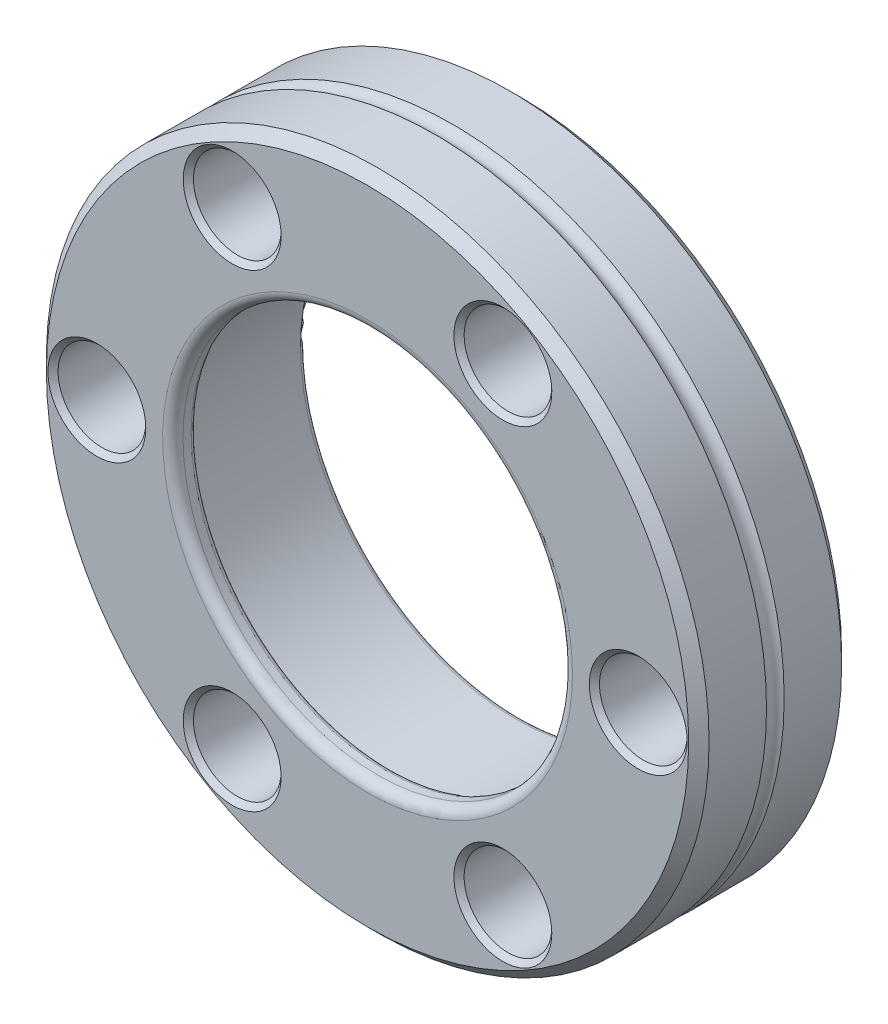
ISO-10303-21;
HEADER;
FILE_DESCRIPTION(('STEP AP214'),'2;1');
FILE_NAME('part.step','',(''),(''),'','','');
FILE_SCHEMA(('AUTOMOTIVE_DESIGN { 1 0 10303 214 1 1 1 1 }'));
ENDSEC;
DATA;
#1=APPLICATION_CONTEXT('core data for automotive mechanical design processes');
#2=APPLICATION_PROTOCOL_DEFINITION('international standard','automotive_design',2000,#1);
#3=PRODUCT_CONTEXT('',#1,'mechanical');
#4=PRODUCT('Part','Part','',(#3));
#5=PRODUCT_RELATED_PRODUCT_CATEGORY('part','',(#4));
#6=PRODUCT_DEFINITION_FORMATION('','',#4);
#7=PRODUCT_DEFINITION_CONTEXT('part definition',#1,'design');
#8=PRODUCT_DEFINITION('design','',#6,#7);
#9=PRODUCT_DEFINITION_SHAPE('','',#8);
#10=(LENGTH_UNIT() NAMED_UNIT(*) SI_UNIT(.MILLI.,.METRE.));
#11=(NAMED_UNIT(*) PLANE_ANGLE_UNIT() SI_UNIT($,.RADIAN.));
#12=(NAMED_UNIT(*) SI_UNIT($,.STERADIAN.) SOLID_ANGLE_UNIT());
#13=UNCERTAINTY_MEASURE_WITH_UNIT(LENGTH_MEASURE(1.E-05),#10,'distance_accuracy_value','');
#14=(GEOMETRIC_REPRESENTATION_CONTEXT(3) GLOBAL_UNCERTAINTY_ASSIGNED_CONTEXT((#13)) GLOBAL_UNIT_ASSIGNED_CONTEXT((#10,
#11,#12)) REPRESENTATION_CONTEXT('',''));
#15=CARTESIAN_POINT('',(0.,0.,0.));
#16=DIRECTION('',(0.,0.,1.));
#17=DIRECTION('',(1.,0.,0.));
#18=AXIS2_PLACEMENT_3D('',#15,#16,#17);
#19=CARTESIAN_POINT('',(0.,0.,-3.81));
#20=DIRECTION('',(0.,0.,1.));
#21=DIRECTION('',(-1.,0.,0.));
#22=AXIS2_PLACEMENT_3D('',#19,#20,#21);
#23=CYLINDRICAL_SURFACE('',#22,10.7061);
#24=CARTESIAN_POINT('',(0.,0.,-3.556));
#25=DIRECTION('',(0.,0.,1.));
#26=DIRECTION('',(-1.,0.,0.));
#27=AXIS2_PLACEMENT_3D('',#24,#25,#26);
#28=CIRCLE('',#27,10.7061);
#29=CARTESIAN_POINT('',(-10.7061,0.,-3.556));
#30=VERTEX_POINT('',#29);
#31=EDGE_CURVE('E230',#30,#30,#28,.T.);
#32=ORIENTED_EDGE('',*,*,#31,.F.);
#33=EDGE_LOOP('',(#32));
#34=FACE_BOUND('',#33,.T.);
#35=CARTESIAN_POINT('',(0.,0.,2.2606));
#36=DIRECTION('',(0.,0.,-1.));
#37=DIRECTION('',(-1.,0.,0.));
#38=AXIS2_PLACEMENT_3D('',#35,#36,#37);
#39=CIRCLE('',#38,10.7061);
#40=CARTESIAN_POINT('',(-10.7061,0.,2.2606));
#41=VERTEX_POINT('',#40);
#42=EDGE_CURVE('E221',#41,#41,#39,.T.);
#43=ORIENTED_EDGE('',*,*,#42,.F.);
#44=EDGE_LOOP('',(#43));
#45=FACE_BOUND('',#44,.T.);
#46=ADVANCED_FACE('F16',(#34,#45),#23,.F.);
#47=CARTESIAN_POINT('',(-6.74369999999402,11.6804310309919,3.81000000004406));
#48=DIRECTION('',(0.,0.,1.));
#49=DIRECTION('',(0.,-1.,0.));
#50=AXIS2_PLACEMENT_3D('',#47,#48,#49);
#51=CONICAL_SURFACE('',#50,2.43839999999539,0.785398163397448);
#52=CARTESIAN_POINT('',(-6.74369999999402,11.6804310309919,3.556));
#53=DIRECTION('',(0.,0.,-1.));
#54=DIRECTION('',(1.,0.,0.));
#55=AXIS2_PLACEMENT_3D('',#52,#53,#54);
#56=CIRCLE('',#55,2.1844);
#57=CARTESIAN_POINT('',(-4.55929999999402,11.6804310309919,3.556));
#58=VERTEX_POINT('',#57);
#59=EDGE_CURVE('E278',#58,#58,#56,.T.);
#60=ORIENTED_EDGE('',*,*,#59,.T.);
#61=EDGE_LOOP('',(#60));
#62=FACE_BOUND('',#61,.T.);
#63=CARTESIAN_POINT('',(-6.74369999999402,11.6804310309919,3.81000000004406));
#64=DIRECTION('',(0.,0.,-1.));
#65=DIRECTION('',(0.,-1.,0.));
#66=AXIS2_PLACEMENT_3D('',#63,#64,#65);
#67=CIRCLE('',#66,2.43839999999539);
#68=CARTESIAN_POINT('',(-6.74369999999402,9.24203103099651,3.81000000004406));
#69=VERTEX_POINT('',#68);
#70=EDGE_CURVE('E259',#69,#69,#67,.T.);
#71=ORIENTED_EDGE('',*,*,#70,.F.);
#72=EDGE_LOOP('',(#71));
#73=FACE_BOUND('',#72,.T.);
#74=ADVANCED_FACE('F329',(#62,#73),#51,.F.);
#75=CARTESIAN_POINT('',(0.,0.,3.81));
#76=DIRECTION('',(0.,0.,-1.));
#77=DIRECTION('',(1.,0.,0.));
#78=AXIS2_PLACEMENT_3D('',#75,#76,#77);
#79=CYLINDRICAL_SURFACE('',#78,9.7028);
#80=CARTESIAN_POINT('',(0.,0.,3.302));
#81=DIRECTION('',(0.,0.,-1.));
#82=DIRECTION('',(1.,0.,0.));
#83=AXIS2_PLACEMENT_3D('',#80,#81,#82);
#84=CIRCLE('',#83,9.7028);
#85=CARTESIAN_POINT('',(9.7028,0.,3.302));
#86=VERTEX_POINT('',#85);
#87=EDGE_CURVE('E214',#86,#86,#84,.T.);
#88=ORIENTED_EDGE('',*,*,#87,.F.);
#89=EDGE_LOOP('',(#88));
#90=FACE_BOUND('',#89,.T.);
#91=CARTESIAN_POINT('',(0.,0.,2.8956));
#92=DIRECTION('',(0.,0.,1.));
#93=DIRECTION('',(1.,0.,0.));
#94=AXIS2_PLACEMENT_3D('',#91,#92,#93);
#95=CIRCLE('',#94,9.7028);
#96=CARTESIAN_POINT('',(9.7028,0.,2.8956));
#97=VERTEX_POINT('',#96);
#98=EDGE_CURVE('E243',#97,#97,#95,.T.);
#99=ORIENTED_EDGE('',*,*,#98,.F.);
#100=EDGE_LOOP('',(#99));
#101=FACE_BOUND('',#100,.T.);
#102=ADVANCED_FACE('F335',(#90,#101),#79,.F.);
#103=CARTESIAN_POINT('',(13.487399999988,0.,3.80999999998722));
#104=DIRECTION('',(0.,0.,1.));
#105=DIRECTION('',(1.,0.,0.));
#106=AXIS2_PLACEMENT_3D('',#103,#104,#105);
#107=CONICAL_SURFACE('',#106,2.43840000005973,0.785398163509344);
#108=CARTESIAN_POINT('',(13.487399999988,0.,3.556));
#109=DIRECTION('',(0.,0.,-1.));
#110=DIRECTION('',(1.,0.,0.));
#111=AXIS2_PLACEMENT_3D('',#108,#109,#110);
#112=CIRCLE('',#111,2.1844);
#113=CARTESIAN_POINT('',(15.671799999988,0.,3.556));
#114=VERTEX_POINT('',#113);
#115=EDGE_CURVE('E275',#114,#114,#112,.T.);
#116=ORIENTED_EDGE('',*,*,#115,.T.);
#117=EDGE_LOOP('',(#116));
#118=FACE_BOUND('',#117,.T.);
#119=CARTESIAN_POINT('',(13.487399999988,0.,3.80999999998722));
#120=DIRECTION('',(0.,0.,-1.));
#121=DIRECTION('',(1.,0.,0.));
#122=AXIS2_PLACEMENT_3D('',#119,#120,#121);
#123=CIRCLE('',#122,2.43840000005973);
#124=CARTESIAN_POINT('',(15.9258000000477,0.,3.80999999998722));
#125=VERTEX_POINT('',#124);
#126=EDGE_CURVE('E291',#125,#125,#123,.T.);
#127=ORIENTED_EDGE('',*,*,#126,.F.);
#128=EDGE_LOOP('',(#127));
#129=FACE_BOUND('',#128,.T.);
#130=ADVANCED_FACE('F325',(#118,#129),#107,.F.);
#131=CARTESIAN_POINT('',(6.74369999999402,-11.6804310309919,3.81));
#132=DIRECTION('',(0.,0.,-1.));
#133=DIRECTION('',(1.,0.,0.));
#134=AXIS2_PLACEMENT_3D('',#131,#132,#133);
#135=CYLINDRICAL_SURFACE('',#134,2.1844);
#136=CARTESIAN_POINT('',(6.74369999999402,-11.6804310309919,3.556));
#137=DIRECTION('',(0.,0.,-1.));
#138=DIRECTION('',(1.,0.,0.));
#139=AXIS2_PLACEMENT_3D('',#136,#137,#138);
#140=CIRCLE('',#139,2.1844);
#141=CARTESIAN_POINT('',(8.92809999999402,-11.6804310309919,3.556));
#142=VERTEX_POINT('',#141);
#143=EDGE_CURVE('E294',#142,#142,#140,.T.);
#144=ORIENTED_EDGE('',*,*,#143,.F.);
#145=EDGE_LOOP('',(#144));
#146=FACE_BOUND('',#145,.T.);
#147=CARTESIAN_POINT('',(6.74369999999402,-11.6804310309919,-3.55600000000323));
#148=DIRECTION('',(0.,0.,-1.));
#149=DIRECTION('',(-1.,0.,0.));
#150=AXIS2_PLACEMENT_3D('',#147,#148,#149);
#151=CIRCLE('',#150,2.1844000000114);
#152=CARTESIAN_POINT('',(4.55929999998262,-11.6804310309919,-3.55600000000323));
#153=VERTEX_POINT('',#152);
#154=EDGE_CURVE('E11',#153,#153,#151,.T.);
#155=ORIENTED_EDGE('',*,*,#154,.T.);
#156=EDGE_LOOP('',(#155));
#157=FACE_BOUND('',#156,.T.);
#158=ADVANCED_FACE('F314',(#146,#157),#135,.F.);
#159=CARTESIAN_POINT('',(-6.74369999999402,-11.6804310309919,3.81));
#160=DIRECTION('',(0.,0.,-1.));
#161=DIRECTION('',(1.,0.,0.));
#162=AXIS2_PLACEMENT_3D('',#159,#160,#161);
#163=CYLINDRICAL_SURFACE('',#162,2.1844);
#164=CARTESIAN_POINT('',(-6.74369999999402,-11.6804310309919,3.556));
#165=DIRECTION('',(0.,0.,-1.));
#166=DIRECTION('',(1.,0.,0.));
#167=AXIS2_PLACEMENT_3D('',#164,#165,#166);
#168=CIRCLE('',#167,2.1844);
#169=CARTESIAN_POINT('',(-4.55929999999402,-11.6804310309919,3.556));
#170=VERTEX_POINT('',#169);
#171=EDGE_CURVE('E19',#170,#170,#168,.T.);
#172=ORIENTED_EDGE('',*,*,#171,.F.);
#173=EDGE_LOOP('',(#172));
#174=FACE_BOUND('',#173,.T.);
#175=CARTESIAN_POINT('',(-6.74369999999402,-11.6804310309919,-3.55600000006006));
#176=DIRECTION('',(0.,0.,-1.));
#177=DIRECTION('',(-1.,0.,0.));
#178=AXIS2_PLACEMENT_3D('',#175,#176,#177);
#179=CIRCLE('',#178,2.18439999999743);
#180=CARTESIAN_POINT('',(-8.92809999999145,-11.6804310309919,-3.55600000006006));
#181=VERTEX_POINT('',#180);
#182=EDGE_CURVE('E191',#181,#181,#179,.T.);
#183=ORIENTED_EDGE('',*,*,#182,.T.);
#184=EDGE_LOOP('',(#183));
#185=FACE_BOUND('',#184,.T.);
#186=ADVANCED_FACE('F192',(#174,#185),#163,.F.);
#187=CARTESIAN_POINT('',(0.,0.,3.302));
#188=DIRECTION('',(0.,0.,-1.));
#189=DIRECTION('',(0.,1.,0.));
#190=AXIS2_PLACEMENT_3D('',#187,#188,#189);
#191=CONICAL_SURFACE('',#190,16.51,0.78539816339745);
#192=CARTESIAN_POINT('',(0.,0.,3.81));
#193=DIRECTION('',(0.,0.,-1.));
#194=DIRECTION('',(0.,1.,0.));
#195=AXIS2_PLACEMENT_3D('',#192,#193,#194);
#196=CIRCLE('',#195,16.002);
#197=CARTESIAN_POINT('',(0.,16.002,3.81));
#198=VERTEX_POINT('',#197);
#199=EDGE_CURVE('E281',#198,#198,#196,.T.);
#200=ORIENTED_EDGE('',*,*,#199,.T.);
#201=EDGE_LOOP('',(#200));
#202=FACE_BOUND('',#201,.T.);
#203=CARTESIAN_POINT('',(0.,0.,3.302));
#204=DIRECTION('',(0.,0.,-1.));
#205=DIRECTION('',(1.,0.,0.));
#206=AXIS2_PLACEMENT_3D('',#203,#204,#205);
#207=CIRCLE('',#206,16.51);
#208=CARTESIAN_POINT('',(16.51,0.,3.302));
#209=VERTEX_POINT('',#208);
#210=EDGE_CURVE('E297',#209,#209,#207,.T.);
#211=ORIENTED_EDGE('',*,*,#210,.F.);
#212=EDGE_LOOP('',(#211));
#213=FACE_BOUND('',#212,.T.);
#214=ADVANCED_FACE('F313',(#202,#213),#191,.T.);
#215=CARTESIAN_POINT('',(0.,0.,-3.81));
#216=DIRECTION('',(0.,0.,-1.));
#217=DIRECTION('',(-1.,0.,0.));
#218=AXIS2_PLACEMENT_3D('',#215,#216,#217);
#219=PLANE('',#218);
#220=CARTESIAN_POINT('',(0.,0.,-3.81));
#221=DIRECTION('',(0.,0.,-1.));
#222=DIRECTION('',(0.,1.,0.));
#223=AXIS2_PLACEMENT_3D('',#220,#221,#222);
#224=CIRCLE('',#223,10.9601);
#225=CARTESIAN_POINT('',(0.,10.9601,-3.81));
#226=VERTEX_POINT('',#225);
#227=EDGE_CURVE('E226',#226,#226,#224,.T.);
#228=ORIENTED_EDGE('',*,*,#227,.F.);
#229=EDGE_LOOP('',(#228));
#230=FACE_BOUND('',#229,.T.);
#231=CARTESIAN_POINT('',(6.74369999999404,11.6804310309919,-3.81000000004406));
#232=DIRECTION('',(0.,0.,1.));
#233=DIRECTION('',(0.,1.,0.));
#234=AXIS2_PLACEMENT_3D('',#231,#232,#233);
#235=CIRCLE('',#234,2.43839999999541);
#236=CARTESIAN_POINT('',(6.74369999999404,14.1188310309873,-3.81000000004406));
#237=VERTEX_POINT('',#236);
#238=EDGE_CURVE('E216',#237,#237,#235,.T.);
#239=ORIENTED_EDGE('',*,*,#238,.T.);
#240=EDGE_LOOP('',(#239));
#241=FACE_BOUND('',#240,.T.);
#242=CARTESIAN_POINT('',(13.487399999988,0.,-3.80999999998722));
#243=DIRECTION('',(0.,0.,1.));
#244=DIRECTION('',(-1.,0.,0.));
#245=AXIS2_PLACEMENT_3D('',#242,#243,#244);
#246=CIRCLE('',#245,2.43839999991708);
#247=CARTESIAN_POINT('',(11.0490000000709,0.,-3.80999999998722));
#248=VERTEX_POINT('',#247);
#249=EDGE_CURVE('E219',#248,#248,#246,.T.);
#250=ORIENTED_EDGE('',*,*,#249,.T.);
#251=EDGE_LOOP('',(#250));
#252=FACE_BOUND('',#251,.T.);
#253=CARTESIAN_POINT('',(6.74369999999402,-11.6804310309919,-3.80999999998722));
#254=DIRECTION('',(0.,0.,1.));
#255=DIRECTION('',(-1.,0.,0.));
#256=AXIS2_PLACEMENT_3D('',#253,#254,#255);
#257=CIRCLE('',#256,2.43839999999539);
#258=CARTESIAN_POINT('',(4.30529999999863,-11.6804310309919,-3.80999999998722));
#259=VERTEX_POINT('',#258);
#260=EDGE_CURVE('E25',#259,#259,#257,.T.);
#261=ORIENTED_EDGE('',*,*,#260,.T.);
#262=EDGE_LOOP('',(#261));
#263=FACE_BOUND('',#262,.T.);
#264=CARTESIAN_POINT('',(-6.74369999999402,-11.6804310309919,-3.81000000004406));
#265=DIRECTION('',(0.,0.,1.));
#266=DIRECTION('',(-1.,0.,0.));
#267=AXIS2_PLACEMENT_3D('',#264,#265,#266);
#268=CIRCLE('',#267,2.43840000003825);
#269=CARTESIAN_POINT('',(-9.18210000003227,-11.6804310309919,-3.81000000004406));
#270=VERTEX_POINT('',#269);
#271=EDGE_CURVE('E196',#270,#270,#268,.T.);
#272=ORIENTED_EDGE('',*,*,#271,.T.);
#273=EDGE_LOOP('',(#272));
#274=FACE_BOUND('',#273,.T.);
#275=CARTESIAN_POINT('',(-13.487399999988,0.,-3.80999999998722));
#276=DIRECTION('',(0.,0.,1.));
#277=DIRECTION('',(-1.,0.,0.));
#278=AXIS2_PLACEMENT_3D('',#275,#276,#277);
#279=CIRCLE('',#278,2.43840000005972);
#280=CARTESIAN_POINT('',(-15.9258000000477,0.,-3.80999999998722));
#281=VERTEX_POINT('',#280);
#282=EDGE_CURVE('E381',#281,#281,#279,.T.);
#283=ORIENTED_EDGE('',*,*,#282,.T.);
#284=EDGE_LOOP('',(#283));
#285=FACE_BOUND('',#284,.T.);
#286=CARTESIAN_POINT('',(-6.74369999999402,11.6804310309919,-3.81000000004406));
#287=DIRECTION('',(0.,0.,1.));
#288=DIRECTION('',(-1.,0.,0.));
#289=AXIS2_PLACEMENT_3D('',#286,#287,#288);
#290=CIRCLE('',#289,2.43840000003826);
#291=CARTESIAN_POINT('',(-9.18210000003228,11.6804310309919,-3.81000000004406));
#292=VERTEX_POINT('',#291);
#293=EDGE_CURVE('E195',#292,#292,#290,.T.);
#294=ORIENTED_EDGE('',*,*,#293,.T.);
#295=EDGE_LOOP('',(#294));
#296=FACE_BOUND('',#295,.T.);
#297=CARTESIAN_POINT('',(0.,0.,-3.81));
#298=DIRECTION('',(0.,0.,-1.));
#299=DIRECTION('',(0.,-1.,0.));
#300=AXIS2_PLACEMENT_3D('',#297,#298,#299);
#301=CIRCLE('',#300,16.002);
#302=CARTESIAN_POINT('',(0.,-16.002,-3.81));
#303=VERTEX_POINT('',#302);
#304=EDGE_CURVE('E208',#303,#303,#301,.T.);
#305=ORIENTED_EDGE('',*,*,#304,.T.);
#306=EDGE_LOOP('',(#305));
#307=FACE_BOUND('',#306,.T.);
#308=ADVANCED_FACE('F322',(#230,#241,#252,#263,#274,#285,#296,#307),#219,.T.);
#309=CARTESIAN_POINT('',(6.74369999999402,-11.6804310309919,-3.80999999993037));
#310=DIRECTION('',(0.,0.,-1.));
#311=DIRECTION('',(-1.,0.,0.));
#312=AXIS2_PLACEMENT_3D('',#309,#310,#311);
#313=CONICAL_SURFACE('',#312,2.43839999993856,0.785398163397448);
#314=ORIENTED_EDGE('',*,*,#154,.F.);
#315=EDGE_LOOP('',(#314));
#316=FACE_BOUND('',#315,.T.);
#317=ORIENTED_EDGE('',*,*,#260,.F.);
#318=EDGE_LOOP('',(#317));
#319=FACE_BOUND('',#318,.T.);
#320=ADVANCED_FACE('F352',(#316,#319),#313,.F.);
#321=CARTESIAN_POINT('',(0.,0.,2.6416));
#322=DIRECTION('',(0.,0.,1.));
#323=DIRECTION('',(0.,-1.,0.));
#324=AXIS2_PLACEMENT_3D('',#321,#322,#323);
#325=PLANE('',#324);
#326=CARTESIAN_POINT('',(0.,0.,2.6416));
#327=DIRECTION('',(0.,0.,-1.));
#328=DIRECTION('',(0.,1.,0.));
#329=AXIS2_PLACEMENT_3D('',#326,#327,#328);
#330=CIRCLE('',#329,9.9568);
#331=CARTESIAN_POINT('',(0.,9.9568,2.6416));
#332=VERTEX_POINT('',#331);
#333=EDGE_CURVE('E224',#332,#332,#330,.T.);
#334=ORIENTED_EDGE('',*,*,#333,.F.);
#335=EDGE_LOOP('',(#334));
#336=FACE_BOUND('',#335,.T.);
#337=CARTESIAN_POINT('',(0.,-1.0601753141614E-05,2.6416));
#338=DIRECTION('',(0.,0.,-1.));
#339=DIRECTION('',(0.999999999999473,1.02679423360823E-06,0.));
#340=AXIS2_PLACEMENT_3D('',#337,#338,#339);
#341=CIRCLE('',#340,10.3251000000054);
#342=CARTESIAN_POINT('',(10.3251,0.,2.6416));
#343=VERTEX_POINT('',#342);
#344=CARTESIAN_POINT('',(-10.3251,0.,2.6416));
#345=VERTEX_POINT('',#344);
#346=EDGE_CURVE('E225',#343,#345,#341,.T.);
#347=ORIENTED_EDGE('',*,*,#346,.T.);
#348=CARTESIAN_POINT('',(0.,1.06017534369507E-05,2.6416));
#349=DIRECTION('',(0.,0.,-1.));
#350=DIRECTION('',(-0.999999999999473,-1.02679426216205E-06,0.));
#351=AXIS2_PLACEMENT_3D('',#348,#349,#350);
#352=CIRCLE('',#351,10.3251000000054);
#353=EDGE_CURVE('E229',#345,#343,#352,.T.);
#354=ORIENTED_EDGE('',*,*,#353,.T.);
#355=EDGE_LOOP('',(#347,#354));
#356=FACE_BOUND('',#355,.T.);
#357=ADVANCED_FACE('F349',(#336,#356),#325,.F.);
#358=CARTESIAN_POINT('',(-13.487399999988,0.,3.80999999998722));
#359=DIRECTION('',(0.,0.,1.));
#360=DIRECTION('',(1.,0.,0.));
#361=AXIS2_PLACEMENT_3D('',#358,#359,#360);
#362=CONICAL_SURFACE('',#361,2.43840000003077,0.785398163397448);
#363=CARTESIAN_POINT('',(-13.487399999988,0.,3.556));
#364=DIRECTION('',(0.,0.,-1.));
#365=DIRECTION('',(1.,0.,0.));
#366=AXIS2_PLACEMENT_3D('',#363,#364,#365);
#367=CIRCLE('',#366,2.1844);
#368=CARTESIAN_POINT('',(-11.302999999988,0.,3.556));
#369=VERTEX_POINT('',#368);
#370=EDGE_CURVE('E292',#369,#369,#367,.T.);
#371=ORIENTED_EDGE('',*,*,#370,.T.);
#372=EDGE_LOOP('',(#371));
#373=FACE_BOUND('',#372,.T.);
#374=CARTESIAN_POINT('',(-13.487399999988,0.,3.80999999998722));
#375=DIRECTION('',(0.,0.,-1.));
#376=DIRECTION('',(1.,0.,0.));
#377=AXIS2_PLACEMENT_3D('',#374,#375,#376);
#378=CIRCLE('',#377,2.43840000003077);
#379=CARTESIAN_POINT('',(-11.0489999999572,0.,3.80999999998722));
#380=VERTEX_POINT('',#379);
#381=EDGE_CURVE('E255',#380,#380,#378,.T.);
#382=ORIENTED_EDGE('',*,*,#381,.F.);
#383=EDGE_LOOP('',(#382));
#384=FACE_BOUND('',#383,.T.);
#385=ADVANCED_FACE('F351',(#373,#384),#362,.F.);
#386=CARTESIAN_POINT('',(-6.74369999999402,-11.6804310309919,3.81000000004406));
#387=DIRECTION('',(0.,0.,1.));
#388=DIRECTION('',(0.,-1.,0.));
#389=AXIS2_PLACEMENT_3D('',#386,#387,#388);
#390=CONICAL_SURFACE('',#389,2.43839999999539,0.785398163397448);
#391=ORIENTED_EDGE('',*,*,#171,.T.);
#392=EDGE_LOOP('',(#391));
#393=FACE_BOUND('',#392,.T.);
#394=CARTESIAN_POINT('',(-6.74369999999402,-11.6804310309919,3.81000000004406));
#395=DIRECTION('',(0.,0.,-1.));
#396=DIRECTION('',(0.,-1.,0.));
#397=AXIS2_PLACEMENT_3D('',#394,#395,#396);
#398=CIRCLE('',#397,2.43839999999539);
#399=CARTESIAN_POINT('',(-6.74369999999402,-14.1188310309873,3.81000000004406));
#400=VERTEX_POINT('',#399);
#401=EDGE_CURVE('E258',#400,#400,#398,.T.);
#402=ORIENTED_EDGE('',*,*,#401,.F.);
#403=EDGE_LOOP('',(#402));
#404=FACE_BOUND('',#403,.T.);
#405=ADVANCED_FACE('F309',(#393,#404),#390,.F.);
#406=CARTESIAN_POINT('',(0.,0.,3.81));
#407=DIRECTION('',(0.,0.,-1.));
#408=DIRECTION('',(1.,0.,0.));
#409=AXIS2_PLACEMENT_3D('',#406,#407,#408);
#410=CYLINDRICAL_SURFACE('',#409,16.51);
#411=ORIENTED_EDGE('',*,*,#210,.T.);
#412=EDGE_LOOP('',(#411));
#413=FACE_BOUND('',#412,.T.);
#414=CARTESIAN_POINT('',(0.,0.,0.439940905122484));
#415=DIRECTION('',(0.,0.,1.));
#416=DIRECTION('',(1.,0.,0.));
#417=AXIS2_PLACEMENT_3D('',#414,#415,#416);
#418=CIRCLE('',#417,16.51);
#419=CARTESIAN_POINT('',(16.51,0.,0.439940905122484));
#420=VERTEX_POINT('',#419);
#421=EDGE_CURVE('E215',#420,#420,#418,.T.);
#422=ORIENTED_EDGE('',*,*,#421,.T.);
#423=EDGE_LOOP('',(#422));
#424=FACE_BOUND('',#423,.T.);
#425=ADVANCED_FACE('F483',(#413,#424),#410,.T.);
#426=CARTESIAN_POINT('',(6.74369999999402,-11.6804310309919,3.8100000001009));
#427=DIRECTION('',(0.,0.,1.));
#428=DIRECTION('',(1.,0.,0.));
#429=AXIS2_PLACEMENT_3D('',#426,#427,#428);
#430=CONICAL_SURFACE('',#429,2.43840000015194,0.785398163397448);
#431=ORIENTED_EDGE('',*,*,#143,.T.);
#432=EDGE_LOOP('',(#431));
#433=FACE_BOUND('',#432,.T.);
#434=CARTESIAN_POINT('',(6.74369999999402,-11.6804310309919,3.81000000004406));
#435=DIRECTION('',(0.,0.,-1.));
#436=DIRECTION('',(1.,0.,0.));
#437=AXIS2_PLACEMENT_3D('',#434,#435,#436);
#438=CIRCLE('',#437,2.4384000000951);
#439=CARTESIAN_POINT('',(9.18210000008912,-11.6804310309919,3.81000000004406));
#440=VERTEX_POINT('',#439);
#441=EDGE_CURVE('E288',#440,#440,#438,.T.);
#442=ORIENTED_EDGE('',*,*,#441,.F.);
#443=EDGE_LOOP('',(#442));
#444=FACE_BOUND('',#443,.T.);
#445=ADVANCED_FACE('F479',(#433,#444),#430,.F.);
#446=CARTESIAN_POINT('',(-13.487399999988,0.,3.81));
#447=DIRECTION('',(0.,0.,-1.));
#448=DIRECTION('',(1.,0.,0.));
#449=AXIS2_PLACEMENT_3D('',#446,#447,#448);
#450=CYLINDRICAL_SURFACE('',#449,2.1844);
#451=ORIENTED_EDGE('',*,*,#370,.F.);
#452=EDGE_LOOP('',(#451));
#453=FACE_BOUND('',#452,.T.);
#454=CARTESIAN_POINT('',(-13.487399999988,0.,-3.55599999994638));
#455=DIRECTION('',(0.,0.,-1.));
#456=DIRECTION('',(-1.,0.,0.));
#457=AXIS2_PLACEMENT_3D('',#454,#455,#456);
#458=CIRCLE('',#457,2.1844000000189);
#459=CARTESIAN_POINT('',(-15.6718000000069,0.,-3.55599999994638));
#460=VERTEX_POINT('',#459);
#461=EDGE_CURVE('E205',#460,#460,#458,.T.);
#462=ORIENTED_EDGE('',*,*,#461,.T.);
#463=EDGE_LOOP('',(#462));
#464=FACE_BOUND('',#463,.T.);
#465=ADVANCED_FACE('F413',(#453,#464),#450,.F.);
#466=CARTESIAN_POINT('',(0.,0.,3.81));
#467=DIRECTION('',(0.,0.,-1.));
#468=DIRECTION('',(-1.,0.,0.));
#469=AXIS2_PLACEMENT_3D('',#466,#467,#468);
#470=PLANE('',#469);
#471=CARTESIAN_POINT('',(0.,0.,3.81));
#472=DIRECTION('',(0.,0.,1.));
#473=DIRECTION('',(0.,-1.,0.));
#474=AXIS2_PLACEMENT_3D('',#471,#472,#473);
#475=CIRCLE('',#474,10.2108);
#476=CARTESIAN_POINT('',(0.,-10.2108,3.81));
#477=VERTEX_POINT('',#476);
#478=EDGE_CURVE('E211',#477,#477,#475,.T.);
#479=ORIENTED_EDGE('',*,*,#478,.F.);
#480=EDGE_LOOP('',(#479));
#481=FACE_BOUND('',#480,.T.);
#482=CARTESIAN_POINT('',(6.74369999999404,11.6804310309919,3.81000000004406));
#483=DIRECTION('',(0.,0.,-1.));
#484=DIRECTION('',(0.,-1.,0.));
#485=AXIS2_PLACEMENT_3D('',#482,#483,#484);
#486=CIRCLE('',#485,2.4383999999814);
#487=CARTESIAN_POINT('',(6.74369999999404,9.24203103101051,3.81000000004406));
#488=VERTEX_POINT('',#487);
#489=EDGE_CURVE('E260',#488,#488,#486,.T.);
#490=ORIENTED_EDGE('',*,*,#489,.T.);
#491=EDGE_LOOP('',(#490));
#492=FACE_BOUND('',#491,.T.);
#493=ORIENTED_EDGE('',*,*,#126,.T.);
#494=EDGE_LOOP('',(#493));
#495=FACE_BOUND('',#494,.T.);
#496=ORIENTED_EDGE('',*,*,#441,.T.);
#497=EDGE_LOOP('',(#496));
#498=FACE_BOUND('',#497,.T.);
#499=ORIENTED_EDGE('',*,*,#401,.T.);
#500=EDGE_LOOP('',(#499));
#501=FACE_BOUND('',#500,.T.);
#502=ORIENTED_EDGE('',*,*,#381,.T.);
#503=EDGE_LOOP('',(#502));
#504=FACE_BOUND('',#503,.T.);
#505=ORIENTED_EDGE('',*,*,#70,.T.);
#506=EDGE_LOOP('',(#505));
#507=FACE_BOUND('',#506,.T.);
#508=ORIENTED_EDGE('',*,*,#199,.F.);
#509=EDGE_LOOP('',(#508));
#510=FACE_BOUND('',#509,.T.);
#511=ADVANCED_FACE('F472',(#481,#492,#495,#498,#501,#504,#507,#510),#470,.F.);
#512=CARTESIAN_POINT('',(-6.74369999999402,11.6804310309919,3.81));
#513=DIRECTION('',(0.,0.,-1.));
#514=DIRECTION('',(1.,0.,0.));
#515=AXIS2_PLACEMENT_3D('',#512,#513,#514);
#516=CYLINDRICAL_SURFACE('',#515,2.1844);
#517=ORIENTED_EDGE('',*,*,#59,.F.);
#518=EDGE_LOOP('',(#517));
#519=FACE_BOUND('',#518,.T.);
#520=CARTESIAN_POINT('',(-6.74369999999402,11.6804310309919,-3.55600000006006));
#521=DIRECTION('',(0.,0.,-1.));
#522=DIRECTION('',(-1.,0.,0.));
#523=AXIS2_PLACEMENT_3D('',#520,#521,#522);
#524=CIRCLE('',#523,2.18439999999743);
#525=CARTESIAN_POINT('',(-8.92809999999145,11.6804310309919,-3.55600000006006));
#526=VERTEX_POINT('',#525);
#527=EDGE_CURVE('E202',#526,#526,#524,.T.);
#528=ORIENTED_EDGE('',*,*,#527,.T.);
#529=EDGE_LOOP('',(#528));
#530=FACE_BOUND('',#529,.T.);
#531=ADVANCED_FACE('F468',(#519,#530),#516,.F.);
#532=CARTESIAN_POINT('',(13.487399999988,0.,3.81));
#533=DIRECTION('',(0.,0.,-1.));
#534=DIRECTION('',(1.,0.,0.));
#535=AXIS2_PLACEMENT_3D('',#532,#533,#534);
#536=CYLINDRICAL_SURFACE('',#535,2.1844);
#537=ORIENTED_EDGE('',*,*,#115,.F.);
#538=EDGE_LOOP('',(#537));
#539=FACE_BOUND('',#538,.T.);
#540=CARTESIAN_POINT('',(13.487399999988,0.,-3.55600000000323));
#541=DIRECTION('',(0.,0.,-1.));
#542=DIRECTION('',(-1.,0.,0.));
#543=AXIS2_PLACEMENT_3D('',#540,#541,#542);
#544=CIRCLE('',#543,2.1843999999331);
#545=CARTESIAN_POINT('',(11.3030000000549,0.,-3.55600000000323));
#546=VERTEX_POINT('',#545);
#547=EDGE_CURVE('E272',#546,#546,#544,.T.);
#548=ORIENTED_EDGE('',*,*,#547,.T.);
#549=EDGE_LOOP('',(#548));
#550=FACE_BOUND('',#549,.T.);
#551=ADVANCED_FACE('F464',(#539,#550),#536,.F.);
#552=CARTESIAN_POINT('',(13.487399999988,0.,-3.80999999993037));
#553=DIRECTION('',(0.,0.,-1.));
#554=DIRECTION('',(-1.,0.,0.));
#555=AXIS2_PLACEMENT_3D('',#552,#553,#554);
#556=CONICAL_SURFACE('',#555,2.43839999986024,0.785398163397448);
#557=ORIENTED_EDGE('',*,*,#547,.F.);
#558=EDGE_LOOP('',(#557));
#559=FACE_BOUND('',#558,.T.);
#560=ORIENTED_EDGE('',*,*,#249,.F.);
#561=EDGE_LOOP('',(#560));
#562=FACE_BOUND('',#561,.T.);
#563=ADVANCED_FACE('F460',(#559,#562),#556,.F.);
#564=CARTESIAN_POINT('',(6.74369999999404,11.6804310309919,-3.81000000004406));
#565=DIRECTION('',(0.,0.,-1.));
#566=DIRECTION('',(0.,1.,0.));
#567=AXIS2_PLACEMENT_3D('',#564,#565,#566);
#568=CONICAL_SURFACE('',#567,2.43839999999541,0.785398163397448);
#569=CARTESIAN_POINT('',(6.74369999999404,11.6804310309919,-3.55600000006006));
#570=DIRECTION('',(0.,0.,-1.));
#571=DIRECTION('',(-1.,0.,0.));
#572=AXIS2_PLACEMENT_3D('',#569,#570,#571);
#573=CIRCLE('',#572,2.18440000001142);
#574=CARTESIAN_POINT('',(4.55929999998262,11.6804310309919,-3.55600000006006));
#575=VERTEX_POINT('',#574);
#576=EDGE_CURVE('E220',#575,#575,#573,.T.);
#577=ORIENTED_EDGE('',*,*,#576,.F.);
#578=EDGE_LOOP('',(#577));
#579=FACE_BOUND('',#578,.T.);
#580=ORIENTED_EDGE('',*,*,#238,.F.);
#581=EDGE_LOOP('',(#580));
#582=FACE_BOUND('',#581,.T.);
#583=ADVANCED_FACE('F456',(#579,#582),#568,.F.);
#584=CARTESIAN_POINT('',(6.74369999999404,11.6804310309919,3.81));
#585=DIRECTION('',(0.,0.,-1.));
#586=DIRECTION('',(1.,0.,0.));
#587=AXIS2_PLACEMENT_3D('',#584,#585,#586);
#588=CYLINDRICAL_SURFACE('',#587,2.1844);
#589=CARTESIAN_POINT('',(6.74369999999404,11.6804310309919,3.556));
#590=DIRECTION('',(0.,0.,-1.));
#591=DIRECTION('',(1.,0.,0.));
#592=AXIS2_PLACEMENT_3D('',#589,#590,#591);
#593=CIRCLE('',#592,2.1844);
#594=CARTESIAN_POINT('',(8.92809999999404,11.6804310309919,3.556));
#595=VERTEX_POINT('',#594);
#596=EDGE_CURVE('E263',#595,#595,#593,.T.);
#597=ORIENTED_EDGE('',*,*,#596,.F.);
#598=EDGE_LOOP('',(#597));
#599=FACE_BOUND('',#598,.T.);
#600=ORIENTED_EDGE('',*,*,#576,.T.);
#601=EDGE_LOOP('',(#600));
#602=FACE_BOUND('',#601,.T.);
#603=ADVANCED_FACE('F452',(#599,#602),#588,.F.);
#604=CARTESIAN_POINT('',(6.74369999999404,11.6804310309919,3.81000000004406));
#605=DIRECTION('',(0.,0.,1.));
#606=DIRECTION('',(0.,-1.,0.));
#607=AXIS2_PLACEMENT_3D('',#604,#605,#606);
#608=CONICAL_SURFACE('',#607,2.4383999999814,0.785398163397448);
#609=ORIENTED_EDGE('',*,*,#596,.T.);
#610=EDGE_LOOP('',(#609));
#611=FACE_BOUND('',#610,.T.);
#612=ORIENTED_EDGE('',*,*,#489,.F.);
#613=EDGE_LOOP('',(#612));
#614=FACE_BOUND('',#613,.T.);
#615=ADVANCED_FACE('F438',(#611,#614),#608,.F.);
#616=CARTESIAN_POINT('',(0.,0.,-3.302));
#617=DIRECTION('',(0.,0.,1.));
#618=DIRECTION('',(0.,-1.,0.));
#619=AXIS2_PLACEMENT_3D('',#616,#617,#618);
#620=CONICAL_SURFACE('',#619,16.51,0.785398163397449);
#621=ORIENTED_EDGE('',*,*,#304,.F.);
#622=EDGE_LOOP('',(#621));
#623=FACE_BOUND('',#622,.T.);
#624=CARTESIAN_POINT('',(0.,0.,-3.302));
#625=DIRECTION('',(0.,0.,-1.));
#626=DIRECTION('',(1.,0.,0.));
#627=AXIS2_PLACEMENT_3D('',#624,#625,#626);
#628=CIRCLE('',#627,16.51);
#629=CARTESIAN_POINT('',(16.51,0.,-3.302));
#630=VERTEX_POINT('',#629);
#631=EDGE_CURVE('E252',#630,#630,#628,.T.);
#632=ORIENTED_EDGE('',*,*,#631,.T.);
#633=EDGE_LOOP('',(#632));
#634=FACE_BOUND('',#633,.T.);
#635=ADVANCED_FACE('F434',(#623,#634),#620,.T.);
#636=CARTESIAN_POINT('',(0.,0.,3.81));
#637=DIRECTION('',(0.,0.,-1.));
#638=DIRECTION('',(1.,0.,0.));
#639=AXIS2_PLACEMENT_3D('',#636,#637,#638);
#640=CYLINDRICAL_SURFACE('',#639,16.51);
#641=CARTESIAN_POINT('',(0.,0.,-0.439940905122498));
#642=DIRECTION('',(0.,0.,-1.));
#643=DIRECTION('',(1.,0.,0.));
#644=AXIS2_PLACEMENT_3D('',#641,#642,#643);
#645=CIRCLE('',#644,16.51);
#646=CARTESIAN_POINT('',(16.51,0.,-0.439940905122498));
#647=VERTEX_POINT('',#646);
#648=EDGE_CURVE('E240',#647,#647,#645,.T.);
#649=ORIENTED_EDGE('',*,*,#648,.T.);
#650=EDGE_LOOP('',(#649));
#651=FACE_BOUND('',#650,.T.);
#652=ORIENTED_EDGE('',*,*,#631,.F.);
#653=EDGE_LOOP('',(#652));
#654=FACE_BOUND('',#653,.T.);
#655=ADVANCED_FACE('F437',(#651,#654),#640,.T.);
#656=CARTESIAN_POINT('',(0.,0.,3.302));
#657=DIRECTION('',(0.,0.,-1.));
#658=DIRECTION('',(0.,1.,0.));
#659=AXIS2_PLACEMENT_3D('',#656,#657,#658);
#660=TOROIDAL_SURFACE('',#659,10.2108,0.508);
#661=ORIENTED_EDGE('',*,*,#87,.T.);
#662=EDGE_LOOP('',(#661));
#663=FACE_BOUND('',#662,.T.);
#664=ORIENTED_EDGE('',*,*,#478,.T.);
#665=EDGE_LOOP('',(#664));
#666=FACE_BOUND('',#665,.T.);
#667=ADVANCED_FACE('F442',(#663,#666),#660,.T.);
#668=CARTESIAN_POINT('',(0.,0.,0.));
#669=DIRECTION('',(0.,0.,1.));
#670=DIRECTION('',(0.,-1.,0.));
#671=AXIS2_PLACEMENT_3D('',#668,#669,#670);
#672=TOROIDAL_SURFACE('',#671,16.764,0.508);
#673=ORIENTED_EDGE('',*,*,#421,.F.);
#674=EDGE_LOOP('',(#673));
#675=FACE_BOUND('',#674,.T.);
#676=ORIENTED_EDGE('',*,*,#648,.F.);
#677=EDGE_LOOP('',(#676));
#678=FACE_BOUND('',#677,.T.);
#679=ADVANCED_FACE('F439',(#675,#678),#672,.F.);
#680=CARTESIAN_POINT('',(0.,0.,2.8956));
#681=DIRECTION('',(0.,0.,1.));
#682=DIRECTION('',(0.,-1.,0.));
#683=AXIS2_PLACEMENT_3D('',#680,#681,#682);
#684=TOROIDAL_SURFACE('',#683,9.9568,0.254);
#685=ORIENTED_EDGE('',*,*,#98,.T.);
#686=EDGE_LOOP('',(#685));
#687=FACE_BOUND('',#686,.T.);
#688=ORIENTED_EDGE('',*,*,#333,.T.);
#689=EDGE_LOOP('',(#688));
#690=FACE_BOUND('',#689,.T.);
#691=ADVANCED_FACE('F345',(#687,#690),#684,.T.);
#692=CARTESIAN_POINT('',(0.,0.,2.26060000000003));
#693=DIRECTION('',(0.,0.,1.));
#694=DIRECTION('',(0.,-1.,0.));
#695=AXIS2_PLACEMENT_3D('',#692,#693,#694);
#696=TOROIDAL_SURFACE('',#695,10.3251,0.380999999999982);
#697=ORIENTED_EDGE('',*,*,#42,.T.);
#698=EDGE_LOOP('',(#697));
#699=FACE_BOUND('',#698,.T.);
#700=ORIENTED_EDGE('',*,*,#353,.F.);
#701=ORIENTED_EDGE('',*,*,#346,.F.);
#702=EDGE_LOOP('',(#700,#701));
#703=FACE_BOUND('',#702,.T.);
#704=ADVANCED_FACE('F341',(#699,#703),#696,.F.);
#705=CARTESIAN_POINT('',(0.,0.,-3.556));
#706=DIRECTION('',(0.,0.,-1.));
#707=DIRECTION('',(0.,1.,0.));
#708=AXIS2_PLACEMENT_3D('',#705,#706,#707);
#709=TOROIDAL_SURFACE('',#708,10.9601,0.253999999999995);
#710=ORIENTED_EDGE('',*,*,#227,.T.);
#711=EDGE_LOOP('',(#710));
#712=FACE_BOUND('',#711,.T.);
#713=ORIENTED_EDGE('',*,*,#31,.T.);
#714=EDGE_LOOP('',(#713));
#715=FACE_BOUND('',#714,.T.);
#716=ADVANCED_FACE('F344',(#712,#715),#709,.T.);
#717=CARTESIAN_POINT('',(-6.74369999999402,11.6804310309919,-3.80999999993037));
#718=DIRECTION('',(0.,0.,-1.));
#719=DIRECTION('',(-1.,0.,0.));
#720=AXIS2_PLACEMENT_3D('',#717,#718,#719);
#721=CONICAL_SURFACE('',#720,2.43839999992457,0.785398163397448);
#722=ORIENTED_EDGE('',*,*,#527,.F.);
#723=EDGE_LOOP('',(#722));
#724=FACE_BOUND('',#723,.T.);
#725=ORIENTED_EDGE('',*,*,#293,.F.);
#726=EDGE_LOOP('',(#725));
#727=FACE_BOUND('',#726,.T.);
#728=ADVANCED_FACE('F424',(#724,#727),#721,.F.);
#729=CARTESIAN_POINT('',(-6.74369999999402,-11.6804310309919,-3.80999999993037));
#730=DIRECTION('',(0.,0.,-1.));
#731=DIRECTION('',(-1.,0.,0.));
#732=AXIS2_PLACEMENT_3D('',#729,#730,#731);
#733=CONICAL_SURFACE('',#732,2.43839999992457,0.785398163397448);
#734=ORIENTED_EDGE('',*,*,#182,.F.);
#735=EDGE_LOOP('',(#734));
#736=FACE_BOUND('',#735,.T.);
#737=ORIENTED_EDGE('',*,*,#271,.F.);
#738=EDGE_LOOP('',(#737));
#739=FACE_BOUND('',#738,.T.);
#740=ADVANCED_FACE('F418',(#736,#739),#733,.F.);
#741=CARTESIAN_POINT('',(-13.487399999988,0.,-3.80999999993037));
#742=DIRECTION('',(0.,0.,-1.));
#743=DIRECTION('',(-1.,0.,0.));
#744=AXIS2_PLACEMENT_3D('',#741,#742,#743);
#745=CONICAL_SURFACE('',#744,2.43840000000288,0.785398163285552);
#746=ORIENTED_EDGE('',*,*,#461,.F.);
#747=EDGE_LOOP('',(#746));
#748=FACE_BOUND('',#747,.T.);
#749=ORIENTED_EDGE('',*,*,#282,.F.);
#750=EDGE_LOOP('',(#749));
#751=FACE_BOUND('',#750,.T.);
#752=ADVANCED_FACE('F415',(#748,#751),#745,.F.);
#753=CLOSED_SHELL('',(#46,#74,#102,#130,#158,#186,#214,#308,#320,#357,#385,#405,#425,#445,#465,
#511,#531,#551,#563,#583,#603,#615,#635,#655,#667,#679,#691,#704,#716,#728,#740,#752));
#754=MANIFOLD_SOLID_BREP('B1',#753);
#755=ADVANCED_BREP_SHAPE_REPRESENTATION('',(#18,#754),#14);
#756=SHAPE_DEFINITION_REPRESENTATION(#9,#755);
ENDSEC;
END-ISO-10303-21;
